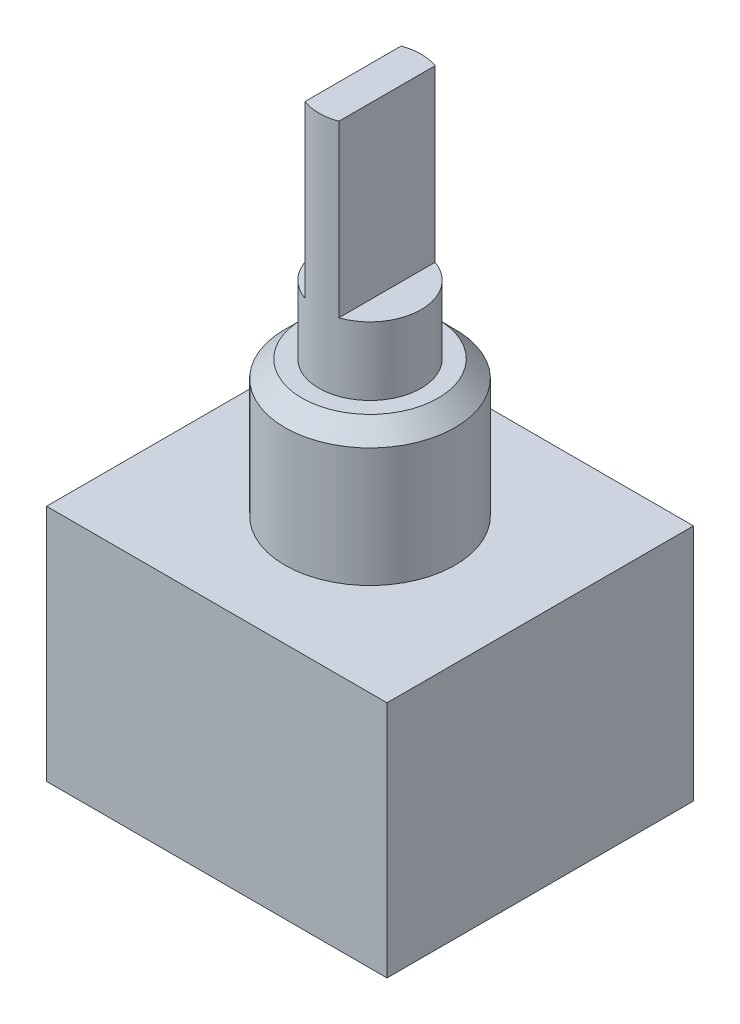
ISO-10303-21;
HEADER;
FILE_DESCRIPTION(('STEP AP214'),'2;1');
FILE_NAME('part.step','',(''),(''),'','','');
FILE_SCHEMA(('AUTOMOTIVE_DESIGN { 1 0 10303 214 1 1 1 1 }'));
ENDSEC;
DATA;
#1=APPLICATION_CONTEXT('core data for automotive mechanical design processes');
#2=APPLICATION_PROTOCOL_DEFINITION('international standard','automotive_design',2000,#1);
#3=PRODUCT_CONTEXT('',#1,'mechanical');
#4=PRODUCT('Part','Part','',(#3));
#5=PRODUCT_RELATED_PRODUCT_CATEGORY('part','',(#4));
#6=PRODUCT_DEFINITION_FORMATION('','',#4);
#7=PRODUCT_DEFINITION_CONTEXT('part definition',#1,'design');
#8=PRODUCT_DEFINITION('design','',#6,#7);
#9=PRODUCT_DEFINITION_SHAPE('','',#8);
#10=(LENGTH_UNIT() NAMED_UNIT(*) SI_UNIT(.MILLI.,.METRE.));
#11=(NAMED_UNIT(*) PLANE_ANGLE_UNIT() SI_UNIT($,.RADIAN.));
#12=(NAMED_UNIT(*) SI_UNIT($,.STERADIAN.) SOLID_ANGLE_UNIT());
#13=UNCERTAINTY_MEASURE_WITH_UNIT(LENGTH_MEASURE(1.E-05),#10,'distance_accuracy_value','');
#14=(GEOMETRIC_REPRESENTATION_CONTEXT(3) GLOBAL_UNCERTAINTY_ASSIGNED_CONTEXT((#13)) GLOBAL_UNIT_ASSIGNED_CONTEXT((#10,
#11,#12)) REPRESENTATION_CONTEXT('',''));
#15=CARTESIAN_POINT('',(0.,0.,0.));
#16=DIRECTION('',(0.,0.,1.));
#17=DIRECTION('',(1.,0.,0.));
#18=AXIS2_PLACEMENT_3D('',#15,#16,#17);
#19=CARTESIAN_POINT('',(5.,7.,4.5));
#20=DIRECTION('',(-1.,0.,0.));
#21=DIRECTION('',(0.,0.,1.));
#22=AXIS2_PLACEMENT_3D('',#19,#20,#21);
#23=PLANE('',#22);
#24=DIRECTION('',(0.,0.,-1.));
#25=VECTOR('',#24,1.);
#26=CARTESIAN_POINT('',(5.,0.,4.5));
#27=LINE('',#26,#25);
#28=CARTESIAN_POINT('',(5.,0.,4.5));
#29=VERTEX_POINT('',#28);
#30=CARTESIAN_POINT('',(5.,0.,-4.5));
#31=VERTEX_POINT('',#30);
#32=EDGE_CURVE('E178',#29,#31,#27,.T.);
#33=ORIENTED_EDGE('',*,*,#32,.T.);
#34=DIRECTION('',(0.,-1.,0.));
#35=VECTOR('',#34,1.);
#36=CARTESIAN_POINT('',(5.,7.,-4.5));
#37=LINE('',#36,#35);
#38=CARTESIAN_POINT('',(5.,7.,-4.5));
#39=VERTEX_POINT('',#38);
#40=EDGE_CURVE('E162',#39,#31,#37,.T.);
#41=ORIENTED_EDGE('',*,*,#40,.F.);
#42=DIRECTION('',(0.,0.,-1.));
#43=VECTOR('',#42,1.);
#44=CARTESIAN_POINT('',(5.,7.,4.5));
#45=LINE('',#44,#43);
#46=CARTESIAN_POINT('',(5.,7.,4.5));
#47=VERTEX_POINT('',#46);
#48=EDGE_CURVE('E163',#47,#39,#45,.T.);
#49=ORIENTED_EDGE('',*,*,#48,.F.);
#50=DIRECTION('',(0.,-1.,0.));
#51=VECTOR('',#50,1.);
#52=CARTESIAN_POINT('',(5.,7.,4.5));
#53=LINE('',#52,#51);
#54=EDGE_CURVE('E177',#47,#29,#53,.T.);
#55=ORIENTED_EDGE('',*,*,#54,.T.);
#56=EDGE_LOOP('',(#33,#41,#49,#55));
#57=FACE_BOUND('',#56,.T.);
#58=ADVANCED_FACE('F45',(#57),#23,.F.);
#59=CARTESIAN_POINT('',(-5.,7.,-4.5));
#60=DIRECTION('',(0.,0.,1.));
#61=DIRECTION('',(1.,0.,0.));
#62=AXIS2_PLACEMENT_3D('',#59,#60,#61);
#63=PLANE('',#62);
#64=DIRECTION('',(-1.,0.,0.));
#65=VECTOR('',#64,1.);
#66=CARTESIAN_POINT('',(-5.,0.,-4.5));
#67=LINE('',#66,#65);
#68=CARTESIAN_POINT('',(-5.,0.,-4.5));
#69=VERTEX_POINT('',#68);
#70=EDGE_CURVE('E182',#31,#69,#67,.T.);
#71=ORIENTED_EDGE('',*,*,#70,.T.);
#72=DIRECTION('',(0.,-1.,0.));
#73=VECTOR('',#72,1.);
#74=CARTESIAN_POINT('',(-5.,7.,-4.5));
#75=LINE('',#74,#73);
#76=CARTESIAN_POINT('',(-5.,7.,-4.5));
#77=VERTEX_POINT('',#76);
#78=EDGE_CURVE('E197',#77,#69,#75,.T.);
#79=ORIENTED_EDGE('',*,*,#78,.F.);
#80=DIRECTION('',(-1.,0.,0.));
#81=VECTOR('',#80,1.);
#82=CARTESIAN_POINT('',(-5.,7.,-4.5));
#83=LINE('',#82,#81);
#84=EDGE_CURVE('E167',#39,#77,#83,.T.);
#85=ORIENTED_EDGE('',*,*,#84,.F.);
#86=ORIENTED_EDGE('',*,*,#40,.T.);
#87=EDGE_LOOP('',(#71,#79,#85,#86));
#88=FACE_BOUND('',#87,.T.);
#89=ADVANCED_FACE('F226',(#88),#63,.F.);
#90=CARTESIAN_POINT('',(-5.,7.,4.5));
#91=DIRECTION('',(1.,0.,0.));
#92=DIRECTION('',(0.,0.,-1.));
#93=AXIS2_PLACEMENT_3D('',#90,#91,#92);
#94=PLANE('',#93);
#95=DIRECTION('',(0.,0.,1.));
#96=VECTOR('',#95,1.);
#97=CARTESIAN_POINT('',(-5.,0.,4.5));
#98=LINE('',#97,#96);
#99=CARTESIAN_POINT('',(-5.,0.,4.5));
#100=VERTEX_POINT('',#99);
#101=EDGE_CURVE('E185',#69,#100,#98,.T.);
#102=ORIENTED_EDGE('',*,*,#101,.T.);
#103=DIRECTION('',(0.,-1.,0.));
#104=VECTOR('',#103,1.);
#105=CARTESIAN_POINT('',(-5.,7.,4.5));
#106=LINE('',#105,#104);
#107=CARTESIAN_POINT('',(-5.,7.,4.5));
#108=VERTEX_POINT('',#107);
#109=EDGE_CURVE('E193',#108,#100,#106,.T.);
#110=ORIENTED_EDGE('',*,*,#109,.F.);
#111=DIRECTION('',(0.,0.,1.));
#112=VECTOR('',#111,1.);
#113=CARTESIAN_POINT('',(-5.,7.,4.5));
#114=LINE('',#113,#112);
#115=EDGE_CURVE('E171',#77,#108,#114,.T.);
#116=ORIENTED_EDGE('',*,*,#115,.F.);
#117=ORIENTED_EDGE('',*,*,#78,.T.);
#118=EDGE_LOOP('',(#102,#110,#116,#117));
#119=FACE_BOUND('',#118,.T.);
#120=ADVANCED_FACE('F231',(#119),#94,.F.);
#121=CARTESIAN_POINT('',(-5.,7.,4.5));
#122=DIRECTION('',(0.,0.,-1.));
#123=DIRECTION('',(-1.,0.,0.));
#124=AXIS2_PLACEMENT_3D('',#121,#122,#123);
#125=PLANE('',#124);
#126=DIRECTION('',(1.,0.,0.));
#127=VECTOR('',#126,1.);
#128=CARTESIAN_POINT('',(-5.,0.,4.5));
#129=LINE('',#128,#127);
#130=EDGE_CURVE('E168',#100,#29,#129,.T.);
#131=ORIENTED_EDGE('',*,*,#130,.T.);
#132=ORIENTED_EDGE('',*,*,#54,.F.);
#133=DIRECTION('',(1.,0.,0.));
#134=VECTOR('',#133,1.);
#135=CARTESIAN_POINT('',(-5.,7.,4.5));
#136=LINE('',#135,#134);
#137=EDGE_CURVE('E174',#108,#47,#136,.T.);
#138=ORIENTED_EDGE('',*,*,#137,.F.);
#139=ORIENTED_EDGE('',*,*,#109,.T.);
#140=EDGE_LOOP('',(#131,#132,#138,#139));
#141=FACE_BOUND('',#140,.T.);
#142=ADVANCED_FACE('F237',(#141),#125,.F.);
#143=CARTESIAN_POINT('',(0.,7.,0.));
#144=DIRECTION('',(0.,-1.,0.));
#145=DIRECTION('',(0.,0.,-1.));
#146=AXIS2_PLACEMENT_3D('',#143,#144,#145);
#147=PLANE('',#146);
#148=CARTESIAN_POINT('',(0.,7.,0.));
#149=DIRECTION('',(0.,1.,0.));
#150=DIRECTION('',(0.,0.,1.));
#151=AXIS2_PLACEMENT_3D('',#148,#149,#150);
#152=CIRCLE('',#151,2.5);
#153=CARTESIAN_POINT('',(0.,7.,2.5));
#154=VERTEX_POINT('',#153);
#155=EDGE_CURVE('E157',#154,#154,#152,.T.);
#156=ORIENTED_EDGE('',*,*,#155,.F.);
#157=EDGE_LOOP('',(#156));
#158=FACE_BOUND('',#157,.T.);
#159=ORIENTED_EDGE('',*,*,#48,.T.);
#160=ORIENTED_EDGE('',*,*,#84,.T.);
#161=ORIENTED_EDGE('',*,*,#115,.T.);
#162=ORIENTED_EDGE('',*,*,#137,.T.);
#163=EDGE_LOOP('',(#159,#160,#161,#162));
#164=FACE_BOUND('',#163,.T.);
#165=ADVANCED_FACE('F241',(#158,#164),#147,.F.);
#166=CARTESIAN_POINT('',(0.,0.,0.));
#167=DIRECTION('',(0.,-1.,0.));
#168=DIRECTION('',(0.,0.,-1.));
#169=AXIS2_PLACEMENT_3D('',#166,#167,#168);
#170=PLANE('',#169);
#171=ORIENTED_EDGE('',*,*,#32,.F.);
#172=ORIENTED_EDGE('',*,*,#130,.F.);
#173=ORIENTED_EDGE('',*,*,#101,.F.);
#174=ORIENTED_EDGE('',*,*,#70,.F.);
#175=EDGE_LOOP('',(#171,#172,#173,#174));
#176=FACE_BOUND('',#175,.T.);
#177=ADVANCED_FACE('F243',(#176),#170,.T.);
#178=CARTESIAN_POINT('',(0.,11.,0.));
#179=DIRECTION('',(0.,-1.,0.));
#180=DIRECTION('',(0.,0.,-1.));
#181=AXIS2_PLACEMENT_3D('',#178,#179,#180);
#182=CYLINDRICAL_SURFACE('',#181,2.5);
#183=CARTESIAN_POINT('',(0.,10.5,0.));
#184=DIRECTION('',(0.,1.,0.));
#185=DIRECTION('',(0.,0.,1.));
#186=AXIS2_PLACEMENT_3D('',#183,#184,#185);
#187=CIRCLE('',#186,2.5);
#188=CARTESIAN_POINT('',(0.,10.5,2.5));
#189=VERTEX_POINT('',#188);
#190=EDGE_CURVE('E50',#189,#189,#187,.F.);
#191=ORIENTED_EDGE('',*,*,#190,.T.);
#192=EDGE_LOOP('',(#191));
#193=FACE_BOUND('',#192,.T.);
#194=ORIENTED_EDGE('',*,*,#155,.T.);
#195=EDGE_LOOP('',(#194));
#196=FACE_BOUND('',#195,.T.);
#197=ADVANCED_FACE('F211',(#193,#196),#182,.T.);
#198=CARTESIAN_POINT('',(0.,11.,0.));
#199=DIRECTION('',(0.,1.,0.));
#200=DIRECTION('',(0.,0.,1.));
#201=AXIS2_PLACEMENT_3D('',#198,#199,#200);
#202=PLANE('',#201);
#203=CARTESIAN_POINT('',(0.,11.,0.));
#204=DIRECTION('',(0.,1.,0.));
#205=DIRECTION('',(0.,0.,1.));
#206=AXIS2_PLACEMENT_3D('',#203,#204,#205);
#207=CIRCLE('',#206,1.5);
#208=CARTESIAN_POINT('',(0.,11.,1.5));
#209=VERTEX_POINT('',#208);
#210=EDGE_CURVE('E11',#209,#209,#207,.T.);
#211=ORIENTED_EDGE('',*,*,#210,.F.);
#212=EDGE_LOOP('',(#211));
#213=FACE_BOUND('',#212,.T.);
#214=CARTESIAN_POINT('',(0.,11.,0.));
#215=DIRECTION('',(0.,1.,0.));
#216=DIRECTION('',(0.,0.,1.));
#217=AXIS2_PLACEMENT_3D('',#214,#215,#216);
#218=CIRCLE('',#217,2.);
#219=CARTESIAN_POINT('',(0.,11.,2.));
#220=VERTEX_POINT('',#219);
#221=EDGE_CURVE('E161',#220,#220,#218,.T.);
#222=ORIENTED_EDGE('',*,*,#221,.T.);
#223=EDGE_LOOP('',(#222));
#224=FACE_BOUND('',#223,.T.);
#225=ADVANCED_FACE('F216',(#213,#224),#202,.T.);
#226=CARTESIAN_POINT('',(0.,11.,0.));
#227=DIRECTION('',(0.,-1.,0.));
#228=DIRECTION('',(0.,0.,-1.));
#229=AXIS2_PLACEMENT_3D('',#226,#227,#228);
#230=CONICAL_SURFACE('',#229,2.,0.785398163397446);
#231=ORIENTED_EDGE('',*,*,#190,.F.);
#232=EDGE_LOOP('',(#231));
#233=FACE_BOUND('',#232,.T.);
#234=ORIENTED_EDGE('',*,*,#221,.F.);
#235=EDGE_LOOP('',(#234));
#236=FACE_BOUND('',#235,.T.);
#237=ADVANCED_FACE('F48',(#233,#236),#230,.T.);
#238=CARTESIAN_POINT('',(0.,18.,0.));
#239=DIRECTION('',(0.,-1.,0.));
#240=DIRECTION('',(0.,0.,-1.));
#241=AXIS2_PLACEMENT_3D('',#238,#239,#240);
#242=CYLINDRICAL_SURFACE('',#241,1.5);
#243=CARTESIAN_POINT('',(0.,18.,0.));
#244=DIRECTION('',(0.,1.,0.));
#245=DIRECTION('',(0.,0.,1.));
#246=AXIS2_PLACEMENT_3D('',#243,#244,#245);
#247=CIRCLE('',#246,1.5);
#248=CARTESIAN_POINT('',(-0.500000000000001,18.,1.4142135623731));
#249=VERTEX_POINT('',#248);
#250=CARTESIAN_POINT('',(0.500000000000001,18.,1.4142135623731));
#251=VERTEX_POINT('',#250);
#252=EDGE_CURVE('E132',#249,#251,#247,.T.);
#253=ORIENTED_EDGE('',*,*,#252,.F.);
#254=DIRECTION('',(0.,1.,0.));
#255=VECTOR('',#254,1.);
#256=CARTESIAN_POINT('',(-0.500000000000001,13.,1.4142135623731));
#257=LINE('',#256,#255);
#258=CARTESIAN_POINT('',(-0.500000000000001,13.,1.4142135623731));
#259=VERTEX_POINT('',#258);
#260=EDGE_CURVE('E63',#259,#249,#257,.T.);
#261=ORIENTED_EDGE('',*,*,#260,.F.);
#262=CARTESIAN_POINT('',(0.,13.,0.));
#263=DIRECTION('',(0.,1.,0.));
#264=DIRECTION('',(0.,0.,1.));
#265=AXIS2_PLACEMENT_3D('',#262,#263,#264);
#266=CIRCLE('',#265,1.5);
#267=CARTESIAN_POINT('',(-0.500000000000001,13.,-1.4142135623731));
#268=VERTEX_POINT('',#267);
#269=EDGE_CURVE('E115',#268,#259,#266,.T.);
#270=ORIENTED_EDGE('',*,*,#269,.F.);
#271=DIRECTION('',(0.,1.,0.));
#272=VECTOR('',#271,1.);
#273=CARTESIAN_POINT('',(-0.500000000000001,13.,-1.4142135623731));
#274=LINE('',#273,#272);
#275=CARTESIAN_POINT('',(-0.500000000000001,18.,-1.4142135623731));
#276=VERTEX_POINT('',#275);
#277=EDGE_CURVE('E124',#268,#276,#274,.T.);
#278=ORIENTED_EDGE('',*,*,#277,.T.);
#279=CARTESIAN_POINT('',(0.500000000000001,18.,-1.4142135623731));
#280=VERTEX_POINT('',#279);
#281=EDGE_CURVE('E155',#280,#276,#247,.T.);
#282=ORIENTED_EDGE('',*,*,#281,.F.);
#283=DIRECTION('',(0.,1.,0.));
#284=VECTOR('',#283,1.);
#285=CARTESIAN_POINT('',(0.500000000000001,13.,-1.4142135623731));
#286=LINE('',#285,#284);
#287=CARTESIAN_POINT('',(0.500000000000001,13.,-1.4142135623731));
#288=VERTEX_POINT('',#287);
#289=EDGE_CURVE('E71',#288,#280,#286,.T.);
#290=ORIENTED_EDGE('',*,*,#289,.F.);
#291=CARTESIAN_POINT('',(0.,13.,0.));
#292=DIRECTION('',(0.,1.,0.));
#293=DIRECTION('',(0.,0.,-1.));
#294=AXIS2_PLACEMENT_3D('',#291,#292,#293);
#295=CIRCLE('',#294,1.5);
#296=CARTESIAN_POINT('',(0.500000000000001,13.,1.4142135623731));
#297=VERTEX_POINT('',#296);
#298=EDGE_CURVE('E139',#297,#288,#295,.T.);
#299=ORIENTED_EDGE('',*,*,#298,.F.);
#300=DIRECTION('',(0.,1.,0.));
#301=VECTOR('',#300,1.);
#302=CARTESIAN_POINT('',(0.500000000000001,13.,1.4142135623731));
#303=LINE('',#302,#301);
#304=EDGE_CURVE('E149',#297,#251,#303,.T.);
#305=ORIENTED_EDGE('',*,*,#304,.T.);
#306=EDGE_LOOP('',(#253,#261,#270,#278,#282,#290,#299,#305));
#307=FACE_BOUND('',#306,.T.);
#308=ORIENTED_EDGE('',*,*,#210,.T.);
#309=EDGE_LOOP('',(#308));
#310=FACE_BOUND('',#309,.T.);
#311=ADVANCED_FACE('F128',(#307,#310),#242,.T.);
#312=CARTESIAN_POINT('',(0.,18.,0.));
#313=DIRECTION('',(0.,1.,0.));
#314=DIRECTION('',(0.,0.,1.));
#315=AXIS2_PLACEMENT_3D('',#312,#313,#314);
#316=PLANE('',#315);
#317=DIRECTION('',(0.,0.,-1.));
#318=VECTOR('',#317,1.);
#319=CARTESIAN_POINT('',(-0.500000000000001,18.,-1.4142135623731));
#320=LINE('',#319,#318);
#321=EDGE_CURVE('E121',#249,#276,#320,.T.);
#322=ORIENTED_EDGE('',*,*,#321,.F.);
#323=ORIENTED_EDGE('',*,*,#252,.T.);
#324=DIRECTION('',(0.,0.,1.));
#325=VECTOR('',#324,1.);
#326=CARTESIAN_POINT('',(0.500000000000001,18.,-1.4142135623731));
#327=LINE('',#326,#325);
#328=EDGE_CURVE('E143',#280,#251,#327,.T.);
#329=ORIENTED_EDGE('',*,*,#328,.F.);
#330=ORIENTED_EDGE('',*,*,#281,.T.);
#331=EDGE_LOOP('',(#322,#323,#329,#330));
#332=FACE_BOUND('',#331,.T.);
#333=ADVANCED_FACE('F221',(#332),#316,.T.);
#334=CARTESIAN_POINT('',(0.500000000000001,13.,-1.4142135623731));
#335=DIRECTION('',(-1.,0.,0.));
#336=DIRECTION('',(0.,0.,1.));
#337=AXIS2_PLACEMENT_3D('',#334,#335,#336);
#338=PLANE('',#337);
#339=ORIENTED_EDGE('',*,*,#328,.T.);
#340=ORIENTED_EDGE('',*,*,#304,.F.);
#341=DIRECTION('',(0.,0.,1.));
#342=VECTOR('',#341,1.);
#343=CARTESIAN_POINT('',(0.500000000000001,13.,-1.4142135623731));
#344=LINE('',#343,#342);
#345=EDGE_CURVE('E142',#288,#297,#344,.T.);
#346=ORIENTED_EDGE('',*,*,#345,.F.);
#347=ORIENTED_EDGE('',*,*,#289,.T.);
#348=EDGE_LOOP('',(#339,#340,#346,#347));
#349=FACE_BOUND('',#348,.T.);
#350=ADVANCED_FACE('F254',(#349),#338,.F.);
#351=CARTESIAN_POINT('',(0.,13.,0.));
#352=DIRECTION('',(0.,-1.,0.));
#353=DIRECTION('',(0.,0.,-1.));
#354=AXIS2_PLACEMENT_3D('',#351,#352,#353);
#355=PLANE('',#354);
#356=ORIENTED_EDGE('',*,*,#298,.T.);
#357=ORIENTED_EDGE('',*,*,#345,.T.);
#358=EDGE_LOOP('',(#356,#357));
#359=FACE_BOUND('',#358,.T.);
#360=ADVANCED_FACE('F258',(#359),#355,.F.);
#361=CARTESIAN_POINT('',(-0.500000000000001,13.,-1.4142135623731));
#362=DIRECTION('',(1.,0.,0.));
#363=DIRECTION('',(0.,0.,-1.));
#364=AXIS2_PLACEMENT_3D('',#361,#362,#363);
#365=PLANE('',#364);
#366=ORIENTED_EDGE('',*,*,#321,.T.);
#367=ORIENTED_EDGE('',*,*,#277,.F.);
#368=DIRECTION('',(0.,0.,-1.));
#369=VECTOR('',#368,1.);
#370=CARTESIAN_POINT('',(-0.500000000000001,13.,-1.4142135623731));
#371=LINE('',#370,#369);
#372=EDGE_CURVE('E117',#259,#268,#371,.T.);
#373=ORIENTED_EDGE('',*,*,#372,.F.);
#374=ORIENTED_EDGE('',*,*,#260,.T.);
#375=EDGE_LOOP('',(#366,#367,#373,#374));
#376=FACE_BOUND('',#375,.T.);
#377=ADVANCED_FACE('F123',(#376),#365,.F.);
#378=CARTESIAN_POINT('',(0.,13.,0.));
#379=DIRECTION('',(0.,1.,0.));
#380=DIRECTION('',(0.,0.,1.));
#381=AXIS2_PLACEMENT_3D('',#378,#379,#380);
#382=PLANE('',#381);
#383=ORIENTED_EDGE('',*,*,#269,.T.);
#384=ORIENTED_EDGE('',*,*,#372,.T.);
#385=EDGE_LOOP('',(#383,#384));
#386=FACE_BOUND('',#385,.T.);
#387=ADVANCED_FACE('F116',(#386),#382,.T.);
#388=CLOSED_SHELL('',(#58,#89,#120,#142,#165,#177,#197,#225,#237,#311,#333,#350,#360,#377,#387));
#389=MANIFOLD_SOLID_BREP('B2',#388);
#390=ADVANCED_BREP_SHAPE_REPRESENTATION('',(#18,#389),#14);
#391=SHAPE_DEFINITION_REPRESENTATION(#9,#390);
ENDSEC;
END-ISO-10303-21;
